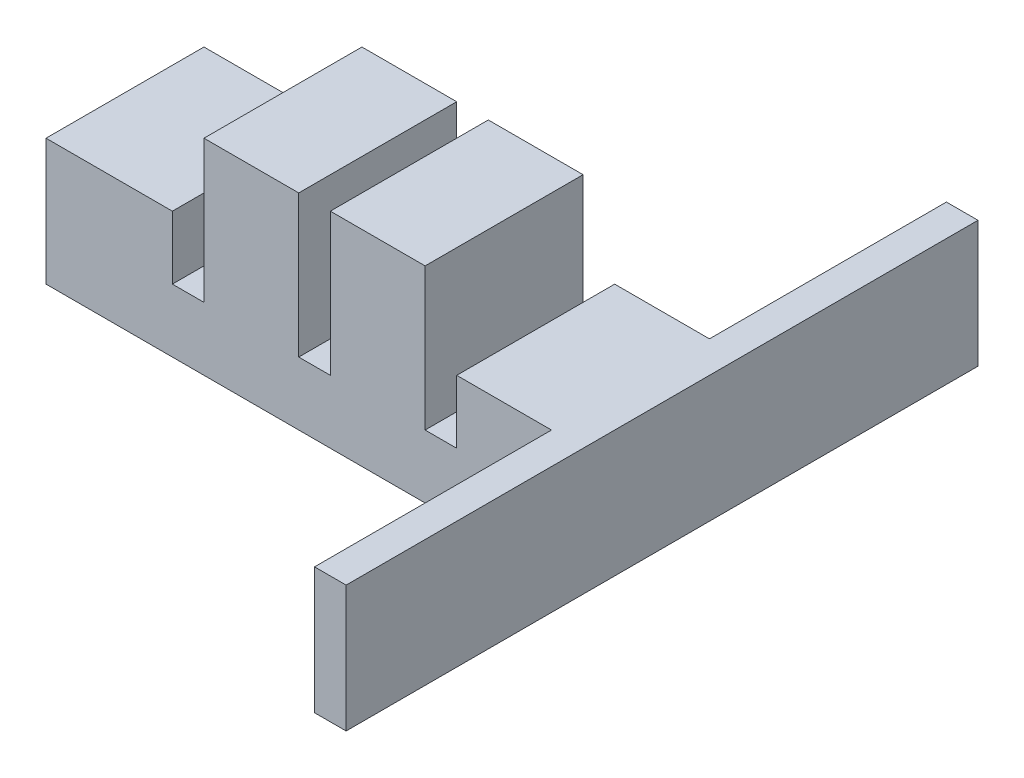
ISO-10303-21;
HEADER;
FILE_DESCRIPTION(('STEP AP214'),'2;1');
FILE_NAME('part.step','',(''),(''),'','','');
FILE_SCHEMA(('AUTOMOTIVE_DESIGN { 1 0 10303 214 1 1 1 1 }'));
ENDSEC;
DATA;
#1=APPLICATION_CONTEXT('core data for automotive mechanical design processes');
#2=APPLICATION_PROTOCOL_DEFINITION('international standard','automotive_design',2000,#1);
#3=PRODUCT_CONTEXT('',#1,'mechanical');
#4=PRODUCT('Part','Part','',(#3));
#5=PRODUCT_RELATED_PRODUCT_CATEGORY('part','',(#4));
#6=PRODUCT_DEFINITION_FORMATION('','',#4);
#7=PRODUCT_DEFINITION_CONTEXT('part definition',#1,'design');
#8=PRODUCT_DEFINITION('design','',#6,#7);
#9=PRODUCT_DEFINITION_SHAPE('','',#8);
#10=(LENGTH_UNIT() NAMED_UNIT(*) SI_UNIT(.MILLI.,.METRE.));
#11=(NAMED_UNIT(*) PLANE_ANGLE_UNIT() SI_UNIT($,.RADIAN.));
#12=(NAMED_UNIT(*) SI_UNIT($,.STERADIAN.) SOLID_ANGLE_UNIT());
#13=UNCERTAINTY_MEASURE_WITH_UNIT(LENGTH_MEASURE(1.E-05),#10,'distance_accuracy_value','');
#14=(GEOMETRIC_REPRESENTATION_CONTEXT(3) GLOBAL_UNCERTAINTY_ASSIGNED_CONTEXT((#13)) GLOBAL_UNIT_ASSIGNED_CONTEXT((#10,
#11,#12)) REPRESENTATION_CONTEXT('',''));
#15=CARTESIAN_POINT('',(0.,0.,0.));
#16=DIRECTION('',(0.,0.,1.));
#17=DIRECTION('',(1.,0.,0.));
#18=AXIS2_PLACEMENT_3D('',#15,#16,#17);
#19=CARTESIAN_POINT('',(-8.,13.,0.));
#20=DIRECTION('',(1.,0.,0.));
#21=DIRECTION('',(0.,0.,-1.));
#22=AXIS2_PLACEMENT_3D('',#19,#20,#21);
#23=PLANE('',#22);
#24=DIRECTION('',(0.,0.,-1.));
#25=VECTOR('',#24,1.);
#26=CARTESIAN_POINT('',(-8.,4.,-10.));
#27=LINE('',#26,#25);
#28=CARTESIAN_POINT('',(-8.,4.,0.));
#29=VERTEX_POINT('',#28);
#30=CARTESIAN_POINT('',(-8.,4.,-10.));
#31=VERTEX_POINT('',#30);
#32=EDGE_CURVE('E492',#29,#31,#27,.T.);
#33=ORIENTED_EDGE('',*,*,#32,.F.);
#34=DIRECTION('',(0.,-1.,0.));
#35=VECTOR('',#34,1.);
#36=CARTESIAN_POINT('',(-8.,13.,0.));
#37=LINE('',#36,#35);
#38=CARTESIAN_POINT('',(-8.,13.,0.));
#39=VERTEX_POINT('',#38);
#40=EDGE_CURVE('E11',#39,#29,#37,.T.);
#41=ORIENTED_EDGE('',*,*,#40,.F.);
#42=DIRECTION('',(0.,0.,1.));
#43=VECTOR('',#42,1.);
#44=CARTESIAN_POINT('',(-8.,13.,0.));
#45=LINE('',#44,#43);
#46=CARTESIAN_POINT('',(-8.,13.,-10.));
#47=VERTEX_POINT('',#46);
#48=EDGE_CURVE('E537',#47,#39,#45,.T.);
#49=ORIENTED_EDGE('',*,*,#48,.F.);
#50=DIRECTION('',(0.,-1.,0.));
#51=VECTOR('',#50,1.);
#52=CARTESIAN_POINT('',(-8.,13.,-10.));
#53=LINE('',#52,#51);
#54=EDGE_CURVE('E547',#47,#31,#53,.T.);
#55=ORIENTED_EDGE('',*,*,#54,.T.);
#56=EDGE_LOOP('',(#33,#41,#49,#55));
#57=FACE_BOUND('',#56,.T.);
#58=ADVANCED_FACE('F39',(#57),#23,.F.);
#59=CARTESIAN_POINT('',(-8.,13.,0.));
#60=DIRECTION('',(0.,0.,-1.));
#61=DIRECTION('',(-1.,0.,0.));
#62=AXIS2_PLACEMENT_3D('',#59,#60,#61);
#63=PLANE('',#62);
#64=DIRECTION('',(1.,0.,0.));
#65=VECTOR('',#64,1.);
#66=CARTESIAN_POINT('',(-8.,0.,0.));
#67=LINE('',#66,#65);
#68=CARTESIAN_POINT('',(-18.,0.,0.));
#69=VERTEX_POINT('',#68);
#70=CARTESIAN_POINT('',(14.,0.,0.));
#71=VERTEX_POINT('',#70);
#72=EDGE_CURVE('E530',#69,#71,#67,.T.);
#73=ORIENTED_EDGE('',*,*,#72,.T.);
#74=DIRECTION('',(0.,-1.,0.));
#75=VECTOR('',#74,1.);
#76=CARTESIAN_POINT('',(14.,0.,0.));
#77=LINE('',#76,#75);
#78=CARTESIAN_POINT('',(14.,8.,0.));
#79=VERTEX_POINT('',#78);
#80=EDGE_CURVE('E349',#79,#71,#77,.T.);
#81=ORIENTED_EDGE('',*,*,#80,.F.);
#82=DIRECTION('',(-1.,0.,0.));
#83=VECTOR('',#82,1.);
#84=CARTESIAN_POINT('',(14.,8.,0.));
#85=LINE('',#84,#83);
#86=CARTESIAN_POINT('',(8.,8.,0.));
#87=VERTEX_POINT('',#86);
#88=EDGE_CURVE('E356',#79,#87,#85,.T.);
#89=ORIENTED_EDGE('',*,*,#88,.T.);
#90=DIRECTION('',(0.,-1.,0.));
#91=VECTOR('',#90,1.);
#92=CARTESIAN_POINT('',(8.,0.,0.));
#93=LINE('',#92,#91);
#94=CARTESIAN_POINT('',(8.,4.,0.));
#95=VERTEX_POINT('',#94);
#96=EDGE_CURVE('E348',#87,#95,#93,.T.);
#97=ORIENTED_EDGE('',*,*,#96,.T.);
#98=DIRECTION('',(-1.,0.,0.));
#99=VECTOR('',#98,1.);
#100=CARTESIAN_POINT('',(8.,4.,0.));
#101=LINE('',#100,#99);
#102=CARTESIAN_POINT('',(6.,4.,0.));
#103=VERTEX_POINT('',#102);
#104=EDGE_CURVE('E371',#95,#103,#101,.T.);
#105=ORIENTED_EDGE('',*,*,#104,.T.);
#106=DIRECTION('',(0.,-1.,0.));
#107=VECTOR('',#106,1.);
#108=CARTESIAN_POINT('',(6.,13.,0.));
#109=LINE('',#108,#107);
#110=CARTESIAN_POINT('',(6.,13.,0.));
#111=VERTEX_POINT('',#110);
#112=EDGE_CURVE('E433',#111,#103,#109,.T.);
#113=ORIENTED_EDGE('',*,*,#112,.F.);
#114=DIRECTION('',(1.,0.,0.));
#115=VECTOR('',#114,1.);
#116=CARTESIAN_POINT('',(0.,13.,0.));
#117=LINE('',#116,#115);
#118=CARTESIAN_POINT('',(0.,13.,0.));
#119=VERTEX_POINT('',#118);
#120=EDGE_CURVE('E422',#119,#111,#117,.T.);
#121=ORIENTED_EDGE('',*,*,#120,.F.);
#122=DIRECTION('',(0.,-1.,0.));
#123=VECTOR('',#122,1.);
#124=CARTESIAN_POINT('',(0.,13.,0.));
#125=LINE('',#124,#123);
#126=CARTESIAN_POINT('',(0.,4.,0.));
#127=VERTEX_POINT('',#126);
#128=EDGE_CURVE('E435',#119,#127,#125,.T.);
#129=ORIENTED_EDGE('',*,*,#128,.T.);
#130=DIRECTION('',(1.,0.,0.));
#131=VECTOR('',#130,1.);
#132=CARTESIAN_POINT('',(-2.,4.,0.));
#133=LINE('',#132,#131);
#134=CARTESIAN_POINT('',(-2.,4.,0.));
#135=VERTEX_POINT('',#134);
#136=EDGE_CURVE('E384',#135,#127,#133,.T.);
#137=ORIENTED_EDGE('',*,*,#136,.F.);
#138=DIRECTION('',(0.,-1.,0.));
#139=VECTOR('',#138,1.);
#140=CARTESIAN_POINT('',(-2.,13.,0.));
#141=LINE('',#140,#139);
#142=CARTESIAN_POINT('',(-2.,13.,0.));
#143=VERTEX_POINT('',#142);
#144=EDGE_CURVE('E46',#143,#135,#141,.T.);
#145=ORIENTED_EDGE('',*,*,#144,.F.);
#146=DIRECTION('',(1.,0.,0.));
#147=VECTOR('',#146,1.);
#148=CARTESIAN_POINT('',(-8.,13.,0.));
#149=LINE('',#148,#147);
#150=EDGE_CURVE('E540',#39,#143,#149,.T.);
#151=ORIENTED_EDGE('',*,*,#150,.F.);
#152=ORIENTED_EDGE('',*,*,#40,.T.);
#153=DIRECTION('',(1.,0.,0.));
#154=VECTOR('',#153,1.);
#155=CARTESIAN_POINT('',(-10.,4.,0.));
#156=LINE('',#155,#154);
#157=CARTESIAN_POINT('',(-10.,4.,0.));
#158=VERTEX_POINT('',#157);
#159=EDGE_CURVE('E501',#158,#29,#156,.T.);
#160=ORIENTED_EDGE('',*,*,#159,.F.);
#161=DIRECTION('',(0.,1.,0.));
#162=VECTOR('',#161,1.);
#163=CARTESIAN_POINT('',(-10.,0.,0.));
#164=LINE('',#163,#162);
#165=CARTESIAN_POINT('',(-10.,8.,0.));
#166=VERTEX_POINT('',#165);
#167=EDGE_CURVE('E463',#158,#166,#164,.T.);
#168=ORIENTED_EDGE('',*,*,#167,.T.);
#169=DIRECTION('',(1.,0.,0.));
#170=VECTOR('',#169,1.);
#171=CARTESIAN_POINT('',(-18.,8.,0.));
#172=LINE('',#171,#170);
#173=CARTESIAN_POINT('',(-18.,8.,0.));
#174=VERTEX_POINT('',#173);
#175=EDGE_CURVE('E489',#174,#166,#172,.T.);
#176=ORIENTED_EDGE('',*,*,#175,.F.);
#177=DIRECTION('',(0.,1.,0.));
#178=VECTOR('',#177,1.);
#179=CARTESIAN_POINT('',(-18.,0.,0.));
#180=LINE('',#179,#178);
#181=EDGE_CURVE('E469',#69,#174,#180,.T.);
#182=ORIENTED_EDGE('',*,*,#181,.F.);
#183=EDGE_LOOP('',(#73,#81,#89,#97,#105,#113,#121,#129,#137,#145,#151,#152,#160,#168,#176,#182));
#184=FACE_BOUND('',#183,.T.);
#185=ADVANCED_FACE('F560',(#184),#63,.F.);
#186=CARTESIAN_POINT('',(-2.,13.,0.));
#187=DIRECTION('',(-1.,0.,0.));
#188=DIRECTION('',(0.,0.,1.));
#189=AXIS2_PLACEMENT_3D('',#186,#187,#188);
#190=PLANE('',#189);
#191=ORIENTED_EDGE('',*,*,#144,.T.);
#192=DIRECTION('',(0.,0.,-1.));
#193=VECTOR('',#192,1.);
#194=CARTESIAN_POINT('',(-2.,4.,-10.));
#195=LINE('',#194,#193);
#196=CARTESIAN_POINT('',(-2.,4.,-10.));
#197=VERTEX_POINT('',#196);
#198=EDGE_CURVE('E380',#135,#197,#195,.T.);
#199=ORIENTED_EDGE('',*,*,#198,.T.);
#200=DIRECTION('',(0.,-1.,0.));
#201=VECTOR('',#200,1.);
#202=CARTESIAN_POINT('',(-2.,13.,-10.));
#203=LINE('',#202,#201);
#204=CARTESIAN_POINT('',(-2.,13.,-10.));
#205=VERTEX_POINT('',#204);
#206=EDGE_CURVE('E551',#205,#197,#203,.T.);
#207=ORIENTED_EDGE('',*,*,#206,.F.);
#208=DIRECTION('',(0.,0.,-1.));
#209=VECTOR('',#208,1.);
#210=CARTESIAN_POINT('',(-2.,13.,0.));
#211=LINE('',#210,#209);
#212=EDGE_CURVE('E543',#143,#205,#211,.T.);
#213=ORIENTED_EDGE('',*,*,#212,.F.);
#214=EDGE_LOOP('',(#191,#199,#207,#213));
#215=FACE_BOUND('',#214,.T.);
#216=ADVANCED_FACE('F557',(#215),#190,.F.);
#217=CARTESIAN_POINT('',(-8.,13.,-10.));
#218=DIRECTION('',(0.,0.,1.));
#219=DIRECTION('',(1.,0.,0.));
#220=AXIS2_PLACEMENT_3D('',#217,#218,#219);
#221=PLANE('',#220);
#222=DIRECTION('',(-1.,0.,0.));
#223=VECTOR('',#222,1.);
#224=CARTESIAN_POINT('',(-8.,0.,-10.));
#225=LINE('',#224,#223);
#226=CARTESIAN_POINT('',(14.,0.,-10.));
#227=VERTEX_POINT('',#226);
#228=CARTESIAN_POINT('',(-18.,0.,-10.));
#229=VERTEX_POINT('',#228);
#230=EDGE_CURVE('E541',#227,#229,#225,.T.);
#231=ORIENTED_EDGE('',*,*,#230,.T.);
#232=DIRECTION('',(0.,-1.,0.));
#233=VECTOR('',#232,1.);
#234=CARTESIAN_POINT('',(-18.,0.,-10.));
#235=LINE('',#234,#233);
#236=CARTESIAN_POINT('',(-18.,8.,-10.));
#237=VERTEX_POINT('',#236);
#238=EDGE_CURVE('E475',#237,#229,#235,.T.);
#239=ORIENTED_EDGE('',*,*,#238,.F.);
#240=DIRECTION('',(1.,0.,0.));
#241=VECTOR('',#240,1.);
#242=CARTESIAN_POINT('',(-18.,8.,-10.));
#243=LINE('',#242,#241);
#244=CARTESIAN_POINT('',(-10.,8.,-10.));
#245=VERTEX_POINT('',#244);
#246=EDGE_CURVE('E481',#237,#245,#243,.T.);
#247=ORIENTED_EDGE('',*,*,#246,.T.);
#248=DIRECTION('',(0.,-1.,0.));
#249=VECTOR('',#248,1.);
#250=CARTESIAN_POINT('',(-10.,0.,-10.));
#251=LINE('',#250,#249);
#252=CARTESIAN_POINT('',(-10.,4.,-10.));
#253=VERTEX_POINT('',#252);
#254=EDGE_CURVE('E473',#245,#253,#251,.T.);
#255=ORIENTED_EDGE('',*,*,#254,.T.);
#256=DIRECTION('',(1.,0.,0.));
#257=VECTOR('',#256,1.);
#258=CARTESIAN_POINT('',(-10.,4.,-10.));
#259=LINE('',#258,#257);
#260=EDGE_CURVE('E496',#253,#31,#259,.T.);
#261=ORIENTED_EDGE('',*,*,#260,.T.);
#262=ORIENTED_EDGE('',*,*,#54,.F.);
#263=DIRECTION('',(-1.,0.,0.));
#264=VECTOR('',#263,1.);
#265=CARTESIAN_POINT('',(-8.,13.,-10.));
#266=LINE('',#265,#264);
#267=EDGE_CURVE('E545',#205,#47,#266,.T.);
#268=ORIENTED_EDGE('',*,*,#267,.F.);
#269=ORIENTED_EDGE('',*,*,#206,.T.);
#270=DIRECTION('',(1.,0.,0.));
#271=VECTOR('',#270,1.);
#272=CARTESIAN_POINT('',(-2.,4.,-10.));
#273=LINE('',#272,#271);
#274=CARTESIAN_POINT('',(0.,4.,-10.));
#275=VERTEX_POINT('',#274);
#276=EDGE_CURVE('E53',#197,#275,#273,.T.);
#277=ORIENTED_EDGE('',*,*,#276,.T.);
#278=DIRECTION('',(0.,-1.,0.));
#279=VECTOR('',#278,1.);
#280=CARTESIAN_POINT('',(0.,13.,-10.));
#281=LINE('',#280,#279);
#282=CARTESIAN_POINT('',(0.,13.,-10.));
#283=VERTEX_POINT('',#282);
#284=EDGE_CURVE('E428',#283,#275,#281,.T.);
#285=ORIENTED_EDGE('',*,*,#284,.F.);
#286=DIRECTION('',(-1.,0.,0.));
#287=VECTOR('',#286,1.);
#288=CARTESIAN_POINT('',(0.,13.,-10.));
#289=LINE('',#288,#287);
#290=CARTESIAN_POINT('',(6.,13.,-10.));
#291=VERTEX_POINT('',#290);
#292=EDGE_CURVE('E426',#291,#283,#289,.T.);
#293=ORIENTED_EDGE('',*,*,#292,.F.);
#294=DIRECTION('',(0.,-1.,0.));
#295=VECTOR('',#294,1.);
#296=CARTESIAN_POINT('',(6.,13.,-10.));
#297=LINE('',#296,#295);
#298=CARTESIAN_POINT('',(6.,4.,-10.));
#299=VERTEX_POINT('',#298);
#300=EDGE_CURVE('E430',#291,#299,#297,.T.);
#301=ORIENTED_EDGE('',*,*,#300,.T.);
#302=DIRECTION('',(-1.,0.,0.));
#303=VECTOR('',#302,1.);
#304=CARTESIAN_POINT('',(8.,4.,-10.));
#305=LINE('',#304,#303);
#306=CARTESIAN_POINT('',(8.,4.,-10.));
#307=VERTEX_POINT('',#306);
#308=EDGE_CURVE('E376',#307,#299,#305,.T.);
#309=ORIENTED_EDGE('',*,*,#308,.F.);
#310=DIRECTION('',(0.,1.,0.));
#311=VECTOR('',#310,1.);
#312=CARTESIAN_POINT('',(8.,0.,-10.));
#313=LINE('',#312,#311);
#314=CARTESIAN_POINT('',(8.,8.,-10.));
#315=VERTEX_POINT('',#314);
#316=EDGE_CURVE('E359',#307,#315,#313,.T.);
#317=ORIENTED_EDGE('',*,*,#316,.T.);
#318=DIRECTION('',(-1.,0.,0.));
#319=VECTOR('',#318,1.);
#320=CARTESIAN_POINT('',(14.,8.,-10.));
#321=LINE('',#320,#319);
#322=CARTESIAN_POINT('',(14.,8.,-10.));
#323=VERTEX_POINT('',#322);
#324=EDGE_CURVE('E364',#323,#315,#321,.T.);
#325=ORIENTED_EDGE('',*,*,#324,.F.);
#326=DIRECTION('',(0.,1.,0.));
#327=VECTOR('',#326,1.);
#328=CARTESIAN_POINT('',(14.,0.,-10.));
#329=LINE('',#328,#327);
#330=EDGE_CURVE('E352',#227,#323,#329,.T.);
#331=ORIENTED_EDGE('',*,*,#330,.F.);
#332=EDGE_LOOP('',(#231,#239,#247,#255,#261,#262,#268,#269,#277,#285,#293,#301,#309,#317,#325,#331));
#333=FACE_BOUND('',#332,.T.);
#334=ADVANCED_FACE('F631',(#333),#221,.F.);
#335=CARTESIAN_POINT('',(-8.,13.,0.));
#336=DIRECTION('',(0.,-1.,0.));
#337=DIRECTION('',(0.,0.,-1.));
#338=AXIS2_PLACEMENT_3D('',#335,#336,#337);
#339=PLANE('',#338);
#340=ORIENTED_EDGE('',*,*,#48,.T.);
#341=ORIENTED_EDGE('',*,*,#150,.T.);
#342=ORIENTED_EDGE('',*,*,#212,.T.);
#343=ORIENTED_EDGE('',*,*,#267,.T.);
#344=EDGE_LOOP('',(#340,#341,#342,#343));
#345=FACE_BOUND('',#344,.T.);
#346=ADVANCED_FACE('F707',(#345),#339,.F.);
#347=CARTESIAN_POINT('',(-8.,0.,0.));
#348=DIRECTION('',(0.,-1.,0.));
#349=DIRECTION('',(0.,0.,-1.));
#350=AXIS2_PLACEMENT_3D('',#347,#348,#349);
#351=PLANE('',#350);
#352=DIRECTION('',(0.,0.,-1.));
#353=VECTOR('',#352,1.);
#354=CARTESIAN_POINT('',(-15.,0.,-2.));
#355=LINE('',#354,#353);
#356=CARTESIAN_POINT('',(-15.,0.,-2.));
#357=VERTEX_POINT('',#356);
#358=CARTESIAN_POINT('',(-15.,0.,-8.));
#359=VERTEX_POINT('',#358);
#360=EDGE_CURVE('E61',#357,#359,#355,.T.);
#361=ORIENTED_EDGE('',*,*,#360,.F.);
#362=DIRECTION('',(-1.,0.,0.));
#363=VECTOR('',#362,1.);
#364=CARTESIAN_POINT('',(-15.,0.,-2.));
#365=LINE('',#364,#363);
#366=CARTESIAN_POINT('',(-11.,0.,-2.));
#367=VERTEX_POINT('',#366);
#368=EDGE_CURVE('E442',#367,#357,#365,.T.);
#369=ORIENTED_EDGE('',*,*,#368,.F.);
#370=DIRECTION('',(0.,0.,1.));
#371=VECTOR('',#370,1.);
#372=CARTESIAN_POINT('',(-11.,0.,-2.));
#373=LINE('',#372,#371);
#374=CARTESIAN_POINT('',(-11.,0.,-8.));
#375=VERTEX_POINT('',#374);
#376=EDGE_CURVE('E456',#375,#367,#373,.T.);
#377=ORIENTED_EDGE('',*,*,#376,.F.);
#378=DIRECTION('',(1.,0.,0.));
#379=VECTOR('',#378,1.);
#380=CARTESIAN_POINT('',(-15.,0.,-8.));
#381=LINE('',#380,#379);
#382=EDGE_CURVE('E453',#359,#375,#381,.T.);
#383=ORIENTED_EDGE('',*,*,#382,.F.);
#384=EDGE_LOOP('',(#361,#369,#377,#383));
#385=FACE_BOUND('',#384,.T.);
#386=DIRECTION('',(0.,0.,1.));
#387=VECTOR('',#386,1.);
#388=CARTESIAN_POINT('',(-3.,0.,-2.));
#389=LINE('',#388,#387);
#390=CARTESIAN_POINT('',(-3.,0.,-8.));
#391=VERTEX_POINT('',#390);
#392=CARTESIAN_POINT('',(-3.,0.,-2.));
#393=VERTEX_POINT('',#392);
#394=EDGE_CURVE('E504',#391,#393,#389,.T.);
#395=ORIENTED_EDGE('',*,*,#394,.F.);
#396=DIRECTION('',(1.,0.,0.));
#397=VECTOR('',#396,1.);
#398=CARTESIAN_POINT('',(-3.,0.,-8.));
#399=LINE('',#398,#397);
#400=CARTESIAN_POINT('',(-7.,0.,-8.));
#401=VERTEX_POINT('',#400);
#402=EDGE_CURVE('E509',#401,#391,#399,.T.);
#403=ORIENTED_EDGE('',*,*,#402,.F.);
#404=DIRECTION('',(0.,0.,-1.));
#405=VECTOR('',#404,1.);
#406=CARTESIAN_POINT('',(-7.,0.,-2.));
#407=LINE('',#406,#405);
#408=CARTESIAN_POINT('',(-7.,0.,-2.));
#409=VERTEX_POINT('',#408);
#410=EDGE_CURVE('E523',#409,#401,#407,.T.);
#411=ORIENTED_EDGE('',*,*,#410,.F.);
#412=DIRECTION('',(-1.,0.,0.));
#413=VECTOR('',#412,1.);
#414=CARTESIAN_POINT('',(-3.,0.,-2.));
#415=LINE('',#414,#413);
#416=EDGE_CURVE('E520',#393,#409,#415,.T.);
#417=ORIENTED_EDGE('',*,*,#416,.F.);
#418=EDGE_LOOP('',(#395,#403,#411,#417));
#419=FACE_BOUND('',#418,.T.);
#420=ORIENTED_EDGE('',*,*,#72,.F.);
#421=DIRECTION('',(0.,0.,1.));
#422=VECTOR('',#421,1.);
#423=CARTESIAN_POINT('',(-18.,0.,0.));
#424=LINE('',#423,#422);
#425=EDGE_CURVE('E478',#229,#69,#424,.T.);
#426=ORIENTED_EDGE('',*,*,#425,.F.);
#427=ORIENTED_EDGE('',*,*,#230,.F.);
#428=DIRECTION('',(0.,0.,-1.));
#429=VECTOR('',#428,1.);
#430=CARTESIAN_POINT('',(14.,0.,-25.));
#431=LINE('',#430,#429);
#432=CARTESIAN_POINT('',(14.,0.,-25.));
#433=VERTEX_POINT('',#432);
#434=EDGE_CURVE('E312',#227,#433,#431,.T.);
#435=ORIENTED_EDGE('',*,*,#434,.T.);
#436=DIRECTION('',(-1.,0.,0.));
#437=VECTOR('',#436,1.);
#438=CARTESIAN_POINT('',(16.,0.,-25.));
#439=LINE('',#438,#437);
#440=CARTESIAN_POINT('',(16.,0.,-25.));
#441=VERTEX_POINT('',#440);
#442=EDGE_CURVE('E345',#441,#433,#439,.T.);
#443=ORIENTED_EDGE('',*,*,#442,.F.);
#444=DIRECTION('',(0.,0.,-1.));
#445=VECTOR('',#444,1.);
#446=CARTESIAN_POINT('',(16.,0.,-25.));
#447=LINE('',#446,#445);
#448=CARTESIAN_POINT('',(16.,0.,15.));
#449=VERTEX_POINT('',#448);
#450=EDGE_CURVE('E316',#449,#441,#447,.T.);
#451=ORIENTED_EDGE('',*,*,#450,.F.);
#452=DIRECTION('',(-1.,0.,0.));
#453=VECTOR('',#452,1.);
#454=CARTESIAN_POINT('',(16.,0.,15.));
#455=LINE('',#454,#453);
#456=CARTESIAN_POINT('',(14.,0.,15.));
#457=VERTEX_POINT('',#456);
#458=EDGE_CURVE('E326',#449,#457,#455,.T.);
#459=ORIENTED_EDGE('',*,*,#458,.T.);
#460=EDGE_CURVE('E327',#457,#71,#431,.T.);
#461=ORIENTED_EDGE('',*,*,#460,.T.);
#462=EDGE_LOOP('',(#420,#426,#427,#435,#443,#451,#459,#461));
#463=FACE_BOUND('',#462,.T.);
#464=DIRECTION('',(0.,0.,-1.));
#465=VECTOR('',#464,1.);
#466=CARTESIAN_POINT('',(9.,0.,-2.));
#467=LINE('',#466,#465);
#468=CARTESIAN_POINT('',(9.,0.,-2.));
#469=VERTEX_POINT('',#468);
#470=CARTESIAN_POINT('',(9.,0.,-8.));
#471=VERTEX_POINT('',#470);
#472=EDGE_CURVE('E280',#469,#471,#467,.T.);
#473=ORIENTED_EDGE('',*,*,#472,.F.);
#474=DIRECTION('',(-1.,0.,0.));
#475=VECTOR('',#474,1.);
#476=CARTESIAN_POINT('',(9.,0.,-2.));
#477=LINE('',#476,#475);
#478=CARTESIAN_POINT('',(13.,0.,-2.));
#479=VERTEX_POINT('',#478);
#480=EDGE_CURVE('E297',#479,#469,#477,.T.);
#481=ORIENTED_EDGE('',*,*,#480,.F.);
#482=DIRECTION('',(0.,0.,1.));
#483=VECTOR('',#482,1.);
#484=CARTESIAN_POINT('',(13.,0.,-2.));
#485=LINE('',#484,#483);
#486=CARTESIAN_POINT('',(13.,0.,-8.));
#487=VERTEX_POINT('',#486);
#488=EDGE_CURVE('E300',#487,#479,#485,.T.);
#489=ORIENTED_EDGE('',*,*,#488,.F.);
#490=DIRECTION('',(1.,0.,0.));
#491=VECTOR('',#490,1.);
#492=CARTESIAN_POINT('',(9.,0.,-8.));
#493=LINE('',#492,#491);
#494=EDGE_CURVE('E306',#471,#487,#493,.T.);
#495=ORIENTED_EDGE('',*,*,#494,.F.);
#496=EDGE_LOOP('',(#473,#481,#489,#495));
#497=FACE_BOUND('',#496,.T.);
#498=DIRECTION('',(0.,0.,1.));
#499=VECTOR('',#498,1.);
#500=CARTESIAN_POINT('',(5.,0.,-2.));
#501=LINE('',#500,#499);
#502=CARTESIAN_POINT('',(5.,0.,-8.));
#503=VERTEX_POINT('',#502);
#504=CARTESIAN_POINT('',(5.,0.,-2.));
#505=VERTEX_POINT('',#504);
#506=EDGE_CURVE('E387',#503,#505,#501,.T.);
#507=ORIENTED_EDGE('',*,*,#506,.F.);
#508=DIRECTION('',(1.,0.,0.));
#509=VECTOR('',#508,1.);
#510=CARTESIAN_POINT('',(5.,0.,-8.));
#511=LINE('',#510,#509);
#512=CARTESIAN_POINT('',(1.,0.,-8.));
#513=VERTEX_POINT('',#512);
#514=EDGE_CURVE('E392',#513,#503,#511,.T.);
#515=ORIENTED_EDGE('',*,*,#514,.F.);
#516=DIRECTION('',(0.,0.,-1.));
#517=VECTOR('',#516,1.);
#518=CARTESIAN_POINT('',(1.,0.,-2.));
#519=LINE('',#518,#517);
#520=CARTESIAN_POINT('',(1.,0.,-2.));
#521=VERTEX_POINT('',#520);
#522=EDGE_CURVE('E406',#521,#513,#519,.T.);
#523=ORIENTED_EDGE('',*,*,#522,.F.);
#524=DIRECTION('',(-1.,0.,0.));
#525=VECTOR('',#524,1.);
#526=CARTESIAN_POINT('',(5.,0.,-2.));
#527=LINE('',#526,#525);
#528=EDGE_CURVE('E403',#505,#521,#527,.T.);
#529=ORIENTED_EDGE('',*,*,#528,.F.);
#530=EDGE_LOOP('',(#507,#515,#523,#529));
#531=FACE_BOUND('',#530,.T.);
#532=ADVANCED_FACE('F603',(#385,#419,#463,#497,#531),#351,.T.);
#533=CARTESIAN_POINT('',(-3.,11.,-2.));
#534=DIRECTION('',(1.,0.,0.));
#535=DIRECTION('',(0.,0.,-1.));
#536=AXIS2_PLACEMENT_3D('',#533,#534,#535);
#537=PLANE('',#536);
#538=ORIENTED_EDGE('',*,*,#394,.T.);
#539=DIRECTION('',(0.,-1.,0.));
#540=VECTOR('',#539,1.);
#541=CARTESIAN_POINT('',(-3.,11.,-2.));
#542=LINE('',#541,#540);
#543=CARTESIAN_POINT('',(-3.,11.,-2.));
#544=VERTEX_POINT('',#543);
#545=EDGE_CURVE('E518',#544,#393,#542,.T.);
#546=ORIENTED_EDGE('',*,*,#545,.F.);
#547=DIRECTION('',(0.,0.,1.));
#548=VECTOR('',#547,1.);
#549=CARTESIAN_POINT('',(-3.,11.,-2.));
#550=LINE('',#549,#548);
#551=CARTESIAN_POINT('',(-3.,11.,-8.));
#552=VERTEX_POINT('',#551);
#553=EDGE_CURVE('E505',#552,#544,#550,.T.);
#554=ORIENTED_EDGE('',*,*,#553,.F.);
#555=DIRECTION('',(0.,-1.,0.));
#556=VECTOR('',#555,1.);
#557=CARTESIAN_POINT('',(-3.,11.,-8.));
#558=LINE('',#557,#556);
#559=EDGE_CURVE('E528',#552,#391,#558,.T.);
#560=ORIENTED_EDGE('',*,*,#559,.T.);
#561=EDGE_LOOP('',(#538,#546,#554,#560));
#562=FACE_BOUND('',#561,.T.);
#563=ADVANCED_FACE('F696',(#562),#537,.F.);
#564=CARTESIAN_POINT('',(-3.,11.,-8.));
#565=DIRECTION('',(0.,0.,-1.));
#566=DIRECTION('',(-1.,0.,0.));
#567=AXIS2_PLACEMENT_3D('',#564,#565,#566);
#568=PLANE('',#567);
#569=ORIENTED_EDGE('',*,*,#402,.T.);
#570=ORIENTED_EDGE('',*,*,#559,.F.);
#571=DIRECTION('',(1.,0.,0.));
#572=VECTOR('',#571,1.);
#573=CARTESIAN_POINT('',(-3.,11.,-8.));
#574=LINE('',#573,#572);
#575=CARTESIAN_POINT('',(-7.,11.,-8.));
#576=VERTEX_POINT('',#575);
#577=EDGE_CURVE('E515',#576,#552,#574,.T.);
#578=ORIENTED_EDGE('',*,*,#577,.F.);
#579=DIRECTION('',(0.,-1.,0.));
#580=VECTOR('',#579,1.);
#581=CARTESIAN_POINT('',(-7.,11.,-8.));
#582=LINE('',#581,#580);
#583=EDGE_CURVE('E531',#576,#401,#582,.T.);
#584=ORIENTED_EDGE('',*,*,#583,.T.);
#585=EDGE_LOOP('',(#569,#570,#578,#584));
#586=FACE_BOUND('',#585,.T.);
#587=ADVANCED_FACE('F692',(#586),#568,.F.);
#588=CARTESIAN_POINT('',(-7.,11.,-2.));
#589=DIRECTION('',(-1.,0.,0.));
#590=DIRECTION('',(0.,0.,1.));
#591=AXIS2_PLACEMENT_3D('',#588,#589,#590);
#592=PLANE('',#591);
#593=ORIENTED_EDGE('',*,*,#410,.T.);
#594=ORIENTED_EDGE('',*,*,#583,.F.);
#595=DIRECTION('',(0.,0.,-1.));
#596=VECTOR('',#595,1.);
#597=CARTESIAN_POINT('',(-7.,11.,-2.));
#598=LINE('',#597,#596);
#599=CARTESIAN_POINT('',(-7.,11.,-2.));
#600=VERTEX_POINT('',#599);
#601=EDGE_CURVE('E512',#600,#576,#598,.T.);
#602=ORIENTED_EDGE('',*,*,#601,.F.);
#603=DIRECTION('',(0.,-1.,0.));
#604=VECTOR('',#603,1.);
#605=CARTESIAN_POINT('',(-7.,11.,-2.));
#606=LINE('',#605,#604);
#607=EDGE_CURVE('E533',#600,#409,#606,.T.);
#608=ORIENTED_EDGE('',*,*,#607,.T.);
#609=EDGE_LOOP('',(#593,#594,#602,#608));
#610=FACE_BOUND('',#609,.T.);
#611=ADVANCED_FACE('F695',(#610),#592,.F.);
#612=CARTESIAN_POINT('',(-3.,11.,-2.));
#613=DIRECTION('',(0.,0.,1.));
#614=DIRECTION('',(1.,0.,0.));
#615=AXIS2_PLACEMENT_3D('',#612,#613,#614);
#616=PLANE('',#615);
#617=ORIENTED_EDGE('',*,*,#416,.T.);
#618=ORIENTED_EDGE('',*,*,#607,.F.);
#619=DIRECTION('',(-1.,0.,0.));
#620=VECTOR('',#619,1.);
#621=CARTESIAN_POINT('',(-3.,11.,-2.));
#622=LINE('',#621,#620);
#623=EDGE_CURVE('E508',#544,#600,#622,.T.);
#624=ORIENTED_EDGE('',*,*,#623,.F.);
#625=ORIENTED_EDGE('',*,*,#545,.T.);
#626=EDGE_LOOP('',(#617,#618,#624,#625));
#627=FACE_BOUND('',#626,.T.);
#628=ADVANCED_FACE('F690',(#627),#616,.F.);
#629=CARTESIAN_POINT('',(-8.,11.,0.));
#630=DIRECTION('',(0.,1.,0.));
#631=DIRECTION('',(0.,0.,1.));
#632=AXIS2_PLACEMENT_3D('',#629,#630,#631);
#633=PLANE('',#632);
#634=ORIENTED_EDGE('',*,*,#553,.T.);
#635=ORIENTED_EDGE('',*,*,#623,.T.);
#636=ORIENTED_EDGE('',*,*,#601,.T.);
#637=ORIENTED_EDGE('',*,*,#577,.T.);
#638=EDGE_LOOP('',(#634,#635,#636,#637));
#639=FACE_BOUND('',#638,.T.);
#640=ADVANCED_FACE('F687',(#639),#633,.F.);
#641=CARTESIAN_POINT('',(-10.,4.,-10.));
#642=DIRECTION('',(0.,-1.,0.));
#643=DIRECTION('',(0.,0.,-1.));
#644=AXIS2_PLACEMENT_3D('',#641,#642,#643);
#645=PLANE('',#644);
#646=ORIENTED_EDGE('',*,*,#32,.T.);
#647=ORIENTED_EDGE('',*,*,#260,.F.);
#648=DIRECTION('',(0.,0.,-1.));
#649=VECTOR('',#648,1.);
#650=CARTESIAN_POINT('',(-10.,4.,-10.));
#651=LINE('',#650,#649);
#652=EDGE_CURVE('E493',#158,#253,#651,.T.);
#653=ORIENTED_EDGE('',*,*,#652,.F.);
#654=ORIENTED_EDGE('',*,*,#159,.T.);
#655=EDGE_LOOP('',(#646,#647,#653,#654));
#656=FACE_BOUND('',#655,.T.);
#657=ADVANCED_FACE('F587',(#656),#645,.F.);
#658=CARTESIAN_POINT('',(-10.,0.,0.));
#659=DIRECTION('',(-1.,0.,0.));
#660=DIRECTION('',(0.,0.,1.));
#661=AXIS2_PLACEMENT_3D('',#658,#659,#660);
#662=PLANE('',#661);
#663=ORIENTED_EDGE('',*,*,#167,.F.);
#664=ORIENTED_EDGE('',*,*,#652,.T.);
#665=ORIENTED_EDGE('',*,*,#254,.F.);
#666=DIRECTION('',(0.,0.,-1.));
#667=VECTOR('',#666,1.);
#668=CARTESIAN_POINT('',(-10.,8.,0.));
#669=LINE('',#668,#667);
#670=EDGE_CURVE('E483',#166,#245,#669,.T.);
#671=ORIENTED_EDGE('',*,*,#670,.F.);
#672=EDGE_LOOP('',(#663,#664,#665,#671));
#673=FACE_BOUND('',#672,.T.);
#674=ADVANCED_FACE('F592',(#673),#662,.F.);
#675=CARTESIAN_POINT('',(-18.,8.,0.));
#676=DIRECTION('',(0.,-1.,0.));
#677=DIRECTION('',(0.,0.,-1.));
#678=AXIS2_PLACEMENT_3D('',#675,#676,#677);
#679=PLANE('',#678);
#680=ORIENTED_EDGE('',*,*,#670,.T.);
#681=ORIENTED_EDGE('',*,*,#246,.F.);
#682=DIRECTION('',(0.,0.,-1.));
#683=VECTOR('',#682,1.);
#684=CARTESIAN_POINT('',(-18.,8.,0.));
#685=LINE('',#684,#683);
#686=EDGE_CURVE('E472',#174,#237,#685,.T.);
#687=ORIENTED_EDGE('',*,*,#686,.F.);
#688=ORIENTED_EDGE('',*,*,#175,.T.);
#689=EDGE_LOOP('',(#680,#681,#687,#688));
#690=FACE_BOUND('',#689,.T.);
#691=ADVANCED_FACE('F596',(#690),#679,.F.);
#692=CARTESIAN_POINT('',(-18.,0.,0.));
#693=DIRECTION('',(-1.,0.,0.));
#694=DIRECTION('',(0.,0.,1.));
#695=AXIS2_PLACEMENT_3D('',#692,#693,#694);
#696=PLANE('',#695);
#697=ORIENTED_EDGE('',*,*,#181,.T.);
#698=ORIENTED_EDGE('',*,*,#686,.T.);
#699=ORIENTED_EDGE('',*,*,#238,.T.);
#700=ORIENTED_EDGE('',*,*,#425,.T.);
#701=EDGE_LOOP('',(#697,#698,#699,#700));
#702=FACE_BOUND('',#701,.T.);
#703=ADVANCED_FACE('F600',(#702),#696,.T.);
#704=CARTESIAN_POINT('',(-15.,6.,-2.));
#705=DIRECTION('',(-1.,0.,0.));
#706=DIRECTION('',(0.,0.,1.));
#707=AXIS2_PLACEMENT_3D('',#704,#705,#706);
#708=PLANE('',#707);
#709=ORIENTED_EDGE('',*,*,#360,.T.);
#710=DIRECTION('',(0.,-1.,0.));
#711=VECTOR('',#710,1.);
#712=CARTESIAN_POINT('',(-15.,6.,-8.));
#713=LINE('',#712,#711);
#714=CARTESIAN_POINT('',(-15.,6.,-8.));
#715=VERTEX_POINT('',#714);
#716=EDGE_CURVE('E451',#715,#359,#713,.T.);
#717=ORIENTED_EDGE('',*,*,#716,.F.);
#718=DIRECTION('',(0.,0.,-1.));
#719=VECTOR('',#718,1.);
#720=CARTESIAN_POINT('',(-15.,6.,-2.));
#721=LINE('',#720,#719);
#722=CARTESIAN_POINT('',(-15.,6.,-2.));
#723=VERTEX_POINT('',#722);
#724=EDGE_CURVE('E438',#723,#715,#721,.T.);
#725=ORIENTED_EDGE('',*,*,#724,.F.);
#726=DIRECTION('',(0.,-1.,0.));
#727=VECTOR('',#726,1.);
#728=CARTESIAN_POINT('',(-15.,6.,-2.));
#729=LINE('',#728,#727);
#730=EDGE_CURVE('E461',#723,#357,#729,.T.);
#731=ORIENTED_EDGE('',*,*,#730,.T.);
#732=EDGE_LOOP('',(#709,#717,#725,#731));
#733=FACE_BOUND('',#732,.T.);
#734=ADVANCED_FACE('F669',(#733),#708,.F.);
#735=CARTESIAN_POINT('',(-15.,6.,-2.));
#736=DIRECTION('',(0.,0.,1.));
#737=DIRECTION('',(1.,0.,0.));
#738=AXIS2_PLACEMENT_3D('',#735,#736,#737);
#739=PLANE('',#738);
#740=ORIENTED_EDGE('',*,*,#368,.T.);
#741=ORIENTED_EDGE('',*,*,#730,.F.);
#742=DIRECTION('',(-1.,0.,0.));
#743=VECTOR('',#742,1.);
#744=CARTESIAN_POINT('',(-15.,6.,-2.));
#745=LINE('',#744,#743);
#746=CARTESIAN_POINT('',(-11.,6.,-2.));
#747=VERTEX_POINT('',#746);
#748=EDGE_CURVE('E448',#747,#723,#745,.T.);
#749=ORIENTED_EDGE('',*,*,#748,.F.);
#750=DIRECTION('',(0.,-1.,0.));
#751=VECTOR('',#750,1.);
#752=CARTESIAN_POINT('',(-11.,6.,-2.));
#753=LINE('',#752,#751);
#754=EDGE_CURVE('E464',#747,#367,#753,.T.);
#755=ORIENTED_EDGE('',*,*,#754,.T.);
#756=EDGE_LOOP('',(#740,#741,#749,#755));
#757=FACE_BOUND('',#756,.T.);
#758=ADVANCED_FACE('F665',(#757),#739,.F.);
#759=CARTESIAN_POINT('',(-11.,6.,-2.));
#760=DIRECTION('',(1.,0.,0.));
#761=DIRECTION('',(0.,0.,-1.));
#762=AXIS2_PLACEMENT_3D('',#759,#760,#761);
#763=PLANE('',#762);
#764=ORIENTED_EDGE('',*,*,#376,.T.);
#765=ORIENTED_EDGE('',*,*,#754,.F.);
#766=DIRECTION('',(0.,0.,1.));
#767=VECTOR('',#766,1.);
#768=CARTESIAN_POINT('',(-11.,6.,-2.));
#769=LINE('',#768,#767);
#770=CARTESIAN_POINT('',(-11.,6.,-8.));
#771=VERTEX_POINT('',#770);
#772=EDGE_CURVE('E445',#771,#747,#769,.T.);
#773=ORIENTED_EDGE('',*,*,#772,.F.);
#774=DIRECTION('',(0.,-1.,0.));
#775=VECTOR('',#774,1.);
#776=CARTESIAN_POINT('',(-11.,6.,-8.));
#777=LINE('',#776,#775);
#778=EDGE_CURVE('E466',#771,#375,#777,.T.);
#779=ORIENTED_EDGE('',*,*,#778,.T.);
#780=EDGE_LOOP('',(#764,#765,#773,#779));
#781=FACE_BOUND('',#780,.T.);
#782=ADVANCED_FACE('F668',(#781),#763,.F.);
#783=CARTESIAN_POINT('',(-15.,6.,-8.));
#784=DIRECTION('',(0.,0.,-1.));
#785=DIRECTION('',(-1.,0.,0.));
#786=AXIS2_PLACEMENT_3D('',#783,#784,#785);
#787=PLANE('',#786);
#788=ORIENTED_EDGE('',*,*,#382,.T.);
#789=ORIENTED_EDGE('',*,*,#778,.F.);
#790=DIRECTION('',(1.,0.,0.));
#791=VECTOR('',#790,1.);
#792=CARTESIAN_POINT('',(-15.,6.,-8.));
#793=LINE('',#792,#791);
#794=EDGE_CURVE('E441',#715,#771,#793,.T.);
#795=ORIENTED_EDGE('',*,*,#794,.F.);
#796=ORIENTED_EDGE('',*,*,#716,.T.);
#797=EDGE_LOOP('',(#788,#789,#795,#796));
#798=FACE_BOUND('',#797,.T.);
#799=ADVANCED_FACE('F663',(#798),#787,.F.);
#800=CARTESIAN_POINT('',(0.,6.,0.));
#801=DIRECTION('',(0.,-1.,0.));
#802=DIRECTION('',(0.,0.,-1.));
#803=AXIS2_PLACEMENT_3D('',#800,#801,#802);
#804=PLANE('',#803);
#805=ORIENTED_EDGE('',*,*,#724,.T.);
#806=ORIENTED_EDGE('',*,*,#794,.T.);
#807=ORIENTED_EDGE('',*,*,#772,.T.);
#808=ORIENTED_EDGE('',*,*,#748,.T.);
#809=EDGE_LOOP('',(#805,#806,#807,#808));
#810=FACE_BOUND('',#809,.T.);
#811=ADVANCED_FACE('F658',(#810),#804,.T.);
#812=CARTESIAN_POINT('',(6.,13.,0.));
#813=DIRECTION('',(-1.,0.,0.));
#814=DIRECTION('',(0.,0.,1.));
#815=AXIS2_PLACEMENT_3D('',#812,#813,#814);
#816=PLANE('',#815);
#817=DIRECTION('',(0.,0.,1.));
#818=VECTOR('',#817,1.);
#819=CARTESIAN_POINT('',(6.,4.,0.));
#820=LINE('',#819,#818);
#821=EDGE_CURVE('E367',#299,#103,#820,.T.);
#822=ORIENTED_EDGE('',*,*,#821,.F.);
#823=ORIENTED_EDGE('',*,*,#300,.F.);
#824=DIRECTION('',(0.,0.,-1.));
#825=VECTOR('',#824,1.);
#826=CARTESIAN_POINT('',(6.,13.,0.));
#827=LINE('',#826,#825);
#828=EDGE_CURVE('E424',#111,#291,#827,.T.);
#829=ORIENTED_EDGE('',*,*,#828,.F.);
#830=ORIENTED_EDGE('',*,*,#112,.T.);
#831=EDGE_LOOP('',(#822,#823,#829,#830));
#832=FACE_BOUND('',#831,.T.);
#833=ADVANCED_FACE('F642',(#832),#816,.F.);
#834=CARTESIAN_POINT('',(0.,13.,0.));
#835=DIRECTION('',(1.,0.,0.));
#836=DIRECTION('',(0.,0.,-1.));
#837=AXIS2_PLACEMENT_3D('',#834,#835,#836);
#838=PLANE('',#837);
#839=DIRECTION('',(0.,0.,-1.));
#840=VECTOR('',#839,1.);
#841=CARTESIAN_POINT('',(0.,4.,-10.));
#842=LINE('',#841,#840);
#843=EDGE_CURVE('E379',#127,#275,#842,.T.);
#844=ORIENTED_EDGE('',*,*,#843,.F.);
#845=ORIENTED_EDGE('',*,*,#128,.F.);
#846=DIRECTION('',(0.,0.,1.));
#847=VECTOR('',#846,1.);
#848=CARTESIAN_POINT('',(0.,13.,0.));
#849=LINE('',#848,#847);
#850=EDGE_CURVE('E413',#283,#119,#849,.T.);
#851=ORIENTED_EDGE('',*,*,#850,.F.);
#852=ORIENTED_EDGE('',*,*,#284,.T.);
#853=EDGE_LOOP('',(#844,#845,#851,#852));
#854=FACE_BOUND('',#853,.T.);
#855=ADVANCED_FACE('F649',(#854),#838,.F.);
#856=CARTESIAN_POINT('',(0.,13.,0.));
#857=DIRECTION('',(0.,-1.,0.));
#858=DIRECTION('',(0.,0.,-1.));
#859=AXIS2_PLACEMENT_3D('',#856,#857,#858);
#860=PLANE('',#859);
#861=ORIENTED_EDGE('',*,*,#850,.T.);
#862=ORIENTED_EDGE('',*,*,#120,.T.);
#863=ORIENTED_EDGE('',*,*,#828,.T.);
#864=ORIENTED_EDGE('',*,*,#292,.T.);
#865=EDGE_LOOP('',(#861,#862,#863,#864));
#866=FACE_BOUND('',#865,.T.);
#867=ADVANCED_FACE('F647',(#866),#860,.F.);
#868=CARTESIAN_POINT('',(5.,11.,-2.));
#869=DIRECTION('',(1.,0.,0.));
#870=DIRECTION('',(0.,0.,-1.));
#871=AXIS2_PLACEMENT_3D('',#868,#869,#870);
#872=PLANE('',#871);
#873=ORIENTED_EDGE('',*,*,#506,.T.);
#874=DIRECTION('',(0.,-1.,0.));
#875=VECTOR('',#874,1.);
#876=CARTESIAN_POINT('',(5.,11.,-2.));
#877=LINE('',#876,#875);
#878=CARTESIAN_POINT('',(5.,11.,-2.));
#879=VERTEX_POINT('',#878);
#880=EDGE_CURVE('E401',#879,#505,#877,.T.);
#881=ORIENTED_EDGE('',*,*,#880,.F.);
#882=DIRECTION('',(0.,0.,1.));
#883=VECTOR('',#882,1.);
#884=CARTESIAN_POINT('',(5.,11.,-2.));
#885=LINE('',#884,#883);
#886=CARTESIAN_POINT('',(5.,11.,-8.));
#887=VERTEX_POINT('',#886);
#888=EDGE_CURVE('E388',#887,#879,#885,.T.);
#889=ORIENTED_EDGE('',*,*,#888,.F.);
#890=DIRECTION('',(0.,-1.,0.));
#891=VECTOR('',#890,1.);
#892=CARTESIAN_POINT('',(5.,11.,-8.));
#893=LINE('',#892,#891);
#894=EDGE_CURVE('E411',#887,#503,#893,.T.);
#895=ORIENTED_EDGE('',*,*,#894,.T.);
#896=EDGE_LOOP('',(#873,#881,#889,#895));
#897=FACE_BOUND('',#896,.T.);
#898=ADVANCED_FACE('F656',(#897),#872,.F.);
#899=CARTESIAN_POINT('',(5.,11.,-8.));
#900=DIRECTION('',(0.,0.,-1.));
#901=DIRECTION('',(-1.,0.,0.));
#902=AXIS2_PLACEMENT_3D('',#899,#900,#901);
#903=PLANE('',#902);
#904=ORIENTED_EDGE('',*,*,#514,.T.);
#905=ORIENTED_EDGE('',*,*,#894,.F.);
#906=DIRECTION('',(1.,0.,0.));
#907=VECTOR('',#906,1.);
#908=CARTESIAN_POINT('',(5.,11.,-8.));
#909=LINE('',#908,#907);
#910=CARTESIAN_POINT('',(1.,11.,-8.));
#911=VERTEX_POINT('',#910);
#912=EDGE_CURVE('E398',#911,#887,#909,.T.);
#913=ORIENTED_EDGE('',*,*,#912,.F.);
#914=DIRECTION('',(0.,-1.,0.));
#915=VECTOR('',#914,1.);
#916=CARTESIAN_POINT('',(1.,11.,-8.));
#917=LINE('',#916,#915);
#918=EDGE_CURVE('E414',#911,#513,#917,.T.);
#919=ORIENTED_EDGE('',*,*,#918,.T.);
#920=EDGE_LOOP('',(#904,#905,#913,#919));
#921=FACE_BOUND('',#920,.T.);
#922=ADVANCED_FACE('F821',(#921),#903,.F.);
#923=CARTESIAN_POINT('',(1.,11.,-2.));
#924=DIRECTION('',(-1.,0.,0.));
#925=DIRECTION('',(0.,0.,1.));
#926=AXIS2_PLACEMENT_3D('',#923,#924,#925);
#927=PLANE('',#926);
#928=ORIENTED_EDGE('',*,*,#522,.T.);
#929=ORIENTED_EDGE('',*,*,#918,.F.);
#930=DIRECTION('',(0.,0.,-1.));
#931=VECTOR('',#930,1.);
#932=CARTESIAN_POINT('',(1.,11.,-2.));
#933=LINE('',#932,#931);
#934=CARTESIAN_POINT('',(1.,11.,-2.));
#935=VERTEX_POINT('',#934);
#936=EDGE_CURVE('E395',#935,#911,#933,.T.);
#937=ORIENTED_EDGE('',*,*,#936,.F.);
#938=DIRECTION('',(0.,-1.,0.));
#939=VECTOR('',#938,1.);
#940=CARTESIAN_POINT('',(1.,11.,-2.));
#941=LINE('',#940,#939);
#942=EDGE_CURVE('E416',#935,#521,#941,.T.);
#943=ORIENTED_EDGE('',*,*,#942,.T.);
#944=EDGE_LOOP('',(#928,#929,#937,#943));
#945=FACE_BOUND('',#944,.T.);
#946=ADVANCED_FACE('F830',(#945),#927,.F.);
#947=CARTESIAN_POINT('',(5.,11.,-2.));
#948=DIRECTION('',(0.,0.,1.));
#949=DIRECTION('',(1.,0.,0.));
#950=AXIS2_PLACEMENT_3D('',#947,#948,#949);
#951=PLANE('',#950);
#952=ORIENTED_EDGE('',*,*,#528,.T.);
#953=ORIENTED_EDGE('',*,*,#942,.F.);
#954=DIRECTION('',(-1.,0.,0.));
#955=VECTOR('',#954,1.);
#956=CARTESIAN_POINT('',(5.,11.,-2.));
#957=LINE('',#956,#955);
#958=EDGE_CURVE('E391',#879,#935,#957,.T.);
#959=ORIENTED_EDGE('',*,*,#958,.F.);
#960=ORIENTED_EDGE('',*,*,#880,.T.);
#961=EDGE_LOOP('',(#952,#953,#959,#960));
#962=FACE_BOUND('',#961,.T.);
#963=ADVANCED_FACE('F574',(#962),#951,.F.);
#964=CARTESIAN_POINT('',(0.,11.,0.));
#965=DIRECTION('',(0.,1.,0.));
#966=DIRECTION('',(0.,0.,1.));
#967=AXIS2_PLACEMENT_3D('',#964,#965,#966);
#968=PLANE('',#967);
#969=ORIENTED_EDGE('',*,*,#888,.T.);
#970=ORIENTED_EDGE('',*,*,#958,.T.);
#971=ORIENTED_EDGE('',*,*,#936,.T.);
#972=ORIENTED_EDGE('',*,*,#912,.T.);
#973=EDGE_LOOP('',(#969,#970,#971,#972));
#974=FACE_BOUND('',#973,.T.);
#975=ADVANCED_FACE('F565',(#974),#968,.F.);
#976=CARTESIAN_POINT('',(-2.,4.,-10.));
#977=DIRECTION('',(0.,-1.,0.));
#978=DIRECTION('',(0.,0.,-1.));
#979=AXIS2_PLACEMENT_3D('',#976,#977,#978);
#980=PLANE('',#979);
#981=ORIENTED_EDGE('',*,*,#843,.T.);
#982=ORIENTED_EDGE('',*,*,#276,.F.);
#983=ORIENTED_EDGE('',*,*,#198,.F.);
#984=ORIENTED_EDGE('',*,*,#136,.T.);
#985=EDGE_LOOP('',(#981,#982,#983,#984));
#986=FACE_BOUND('',#985,.T.);
#987=ADVANCED_FACE('F562',(#986),#980,.F.);
#988=CARTESIAN_POINT('',(8.,4.,0.));
#989=DIRECTION('',(0.,-1.,0.));
#990=DIRECTION('',(0.,0.,-1.));
#991=AXIS2_PLACEMENT_3D('',#988,#989,#990);
#992=PLANE('',#991);
#993=ORIENTED_EDGE('',*,*,#821,.T.);
#994=ORIENTED_EDGE('',*,*,#104,.F.);
#995=DIRECTION('',(0.,0.,1.));
#996=VECTOR('',#995,1.);
#997=CARTESIAN_POINT('',(8.,4.,0.));
#998=LINE('',#997,#996);
#999=EDGE_CURVE('E368',#307,#95,#998,.T.);
#1000=ORIENTED_EDGE('',*,*,#999,.F.);
#1001=ORIENTED_EDGE('',*,*,#308,.T.);
#1002=EDGE_LOOP('',(#993,#994,#1000,#1001));
#1003=FACE_BOUND('',#1002,.T.);
#1004=ADVANCED_FACE('F564',(#1003),#992,.F.);
#1005=CARTESIAN_POINT('',(14.,8.,0.));
#1006=DIRECTION('',(0.,-1.,0.));
#1007=DIRECTION('',(0.,0.,-1.));
#1008=AXIS2_PLACEMENT_3D('',#1005,#1006,#1007);
#1009=PLANE('',#1008);
#1010=DIRECTION('',(0.,0.,1.));
#1011=VECTOR('',#1010,1.);
#1012=CARTESIAN_POINT('',(8.,8.,0.));
#1013=LINE('',#1012,#1011);
#1014=EDGE_CURVE('E353',#315,#87,#1013,.T.);
#1015=ORIENTED_EDGE('',*,*,#1014,.T.);
#1016=ORIENTED_EDGE('',*,*,#88,.F.);
#1017=DIRECTION('',(0.,0.,1.));
#1018=VECTOR('',#1017,1.);
#1019=CARTESIAN_POINT('',(14.,8.,15.));
#1020=LINE('',#1019,#1018);
#1021=CARTESIAN_POINT('',(14.,8.,15.));
#1022=VERTEX_POINT('',#1021);
#1023=EDGE_CURVE('E332',#79,#1022,#1020,.T.);
#1024=ORIENTED_EDGE('',*,*,#1023,.T.);
#1025=DIRECTION('',(-1.,0.,0.));
#1026=VECTOR('',#1025,1.);
#1027=CARTESIAN_POINT('',(16.,8.,15.));
#1028=LINE('',#1027,#1026);
#1029=CARTESIAN_POINT('',(16.,8.,15.));
#1030=VERTEX_POINT('',#1029);
#1031=EDGE_CURVE('E339',#1030,#1022,#1028,.T.);
#1032=ORIENTED_EDGE('',*,*,#1031,.F.);
#1033=DIRECTION('',(0.,0.,1.));
#1034=VECTOR('',#1033,1.);
#1035=CARTESIAN_POINT('',(16.,8.,15.));
#1036=LINE('',#1035,#1034);
#1037=CARTESIAN_POINT('',(16.,8.,-25.));
#1038=VERTEX_POINT('',#1037);
#1039=EDGE_CURVE('E322',#1038,#1030,#1036,.T.);
#1040=ORIENTED_EDGE('',*,*,#1039,.F.);
#1041=DIRECTION('',(-1.,0.,0.));
#1042=VECTOR('',#1041,1.);
#1043=CARTESIAN_POINT('',(16.,8.,-25.));
#1044=LINE('',#1043,#1042);
#1045=CARTESIAN_POINT('',(14.,8.,-25.));
#1046=VERTEX_POINT('',#1045);
#1047=EDGE_CURVE('E342',#1038,#1046,#1044,.T.);
#1048=ORIENTED_EDGE('',*,*,#1047,.T.);
#1049=EDGE_CURVE('E333',#1046,#323,#1020,.T.);
#1050=ORIENTED_EDGE('',*,*,#1049,.T.);
#1051=ORIENTED_EDGE('',*,*,#324,.T.);
#1052=EDGE_LOOP('',(#1015,#1016,#1024,#1032,#1040,#1048,#1050,#1051));
#1053=FACE_BOUND('',#1052,.T.);
#1054=ADVANCED_FACE('F571',(#1053),#1009,.F.);
#1055=CARTESIAN_POINT('',(8.,0.,0.));
#1056=DIRECTION('',(-1.,0.,0.));
#1057=DIRECTION('',(0.,0.,1.));
#1058=AXIS2_PLACEMENT_3D('',#1055,#1056,#1057);
#1059=PLANE('',#1058);
#1060=ORIENTED_EDGE('',*,*,#316,.F.);
#1061=ORIENTED_EDGE('',*,*,#999,.T.);
#1062=ORIENTED_EDGE('',*,*,#96,.F.);
#1063=ORIENTED_EDGE('',*,*,#1014,.F.);
#1064=EDGE_LOOP('',(#1060,#1061,#1062,#1063));
#1065=FACE_BOUND('',#1064,.T.);
#1066=ADVANCED_FACE('F636',(#1065),#1059,.T.);
#1067=CARTESIAN_POINT('',(14.,0.,0.));
#1068=DIRECTION('',(-1.,0.,0.));
#1069=DIRECTION('',(0.,0.,1.));
#1070=AXIS2_PLACEMENT_3D('',#1067,#1068,#1069);
#1071=PLANE('',#1070);
#1072=ORIENTED_EDGE('',*,*,#1023,.F.);
#1073=ORIENTED_EDGE('',*,*,#80,.T.);
#1074=ORIENTED_EDGE('',*,*,#460,.F.);
#1075=DIRECTION('',(0.,-1.,0.));
#1076=VECTOR('',#1075,1.);
#1077=CARTESIAN_POINT('',(14.,0.,15.));
#1078=LINE('',#1077,#1076);
#1079=EDGE_CURVE('E320',#1022,#457,#1078,.T.);
#1080=ORIENTED_EDGE('',*,*,#1079,.F.);
#1081=EDGE_LOOP('',(#1072,#1073,#1074,#1080));
#1082=FACE_BOUND('',#1081,.T.);
#1083=ADVANCED_FACE('F610',(#1082),#1071,.T.);
#1084=CARTESIAN_POINT('',(16.,0.,-25.));
#1085=DIRECTION('',(0.,0.,1.));
#1086=DIRECTION('',(1.,0.,0.));
#1087=AXIS2_PLACEMENT_3D('',#1084,#1085,#1086);
#1088=PLANE('',#1087);
#1089=DIRECTION('',(0.,1.,0.));
#1090=VECTOR('',#1089,1.);
#1091=CARTESIAN_POINT('',(14.,0.,-25.));
#1092=LINE('',#1091,#1090);
#1093=EDGE_CURVE('E330',#433,#1046,#1092,.T.);
#1094=ORIENTED_EDGE('',*,*,#1093,.T.);
#1095=ORIENTED_EDGE('',*,*,#1047,.F.);
#1096=DIRECTION('',(0.,1.,0.));
#1097=VECTOR('',#1096,1.);
#1098=CARTESIAN_POINT('',(16.,0.,-25.));
#1099=LINE('',#1098,#1097);
#1100=EDGE_CURVE('E319',#441,#1038,#1099,.T.);
#1101=ORIENTED_EDGE('',*,*,#1100,.F.);
#1102=ORIENTED_EDGE('',*,*,#442,.T.);
#1103=EDGE_LOOP('',(#1094,#1095,#1101,#1102));
#1104=FACE_BOUND('',#1103,.T.);
#1105=ADVANCED_FACE('F882',(#1104),#1088,.F.);
#1106=CARTESIAN_POINT('',(16.,0.,15.));
#1107=DIRECTION('',(0.,0.,-1.));
#1108=DIRECTION('',(-1.,0.,0.));
#1109=AXIS2_PLACEMENT_3D('',#1106,#1107,#1108);
#1110=PLANE('',#1109);
#1111=ORIENTED_EDGE('',*,*,#1079,.T.);
#1112=ORIENTED_EDGE('',*,*,#458,.F.);
#1113=DIRECTION('',(0.,-1.,0.));
#1114=VECTOR('',#1113,1.);
#1115=CARTESIAN_POINT('',(16.,0.,15.));
#1116=LINE('',#1115,#1114);
#1117=EDGE_CURVE('E324',#1030,#449,#1116,.T.);
#1118=ORIENTED_EDGE('',*,*,#1117,.F.);
#1119=ORIENTED_EDGE('',*,*,#1031,.T.);
#1120=EDGE_LOOP('',(#1111,#1112,#1118,#1119));
#1121=FACE_BOUND('',#1120,.T.);
#1122=ADVANCED_FACE('F617',(#1121),#1110,.F.);
#1123=CARTESIAN_POINT('',(16.,0.,0.));
#1124=DIRECTION('',(-1.,0.,0.));
#1125=DIRECTION('',(0.,0.,1.));
#1126=AXIS2_PLACEMENT_3D('',#1123,#1124,#1125);
#1127=PLANE('',#1126);
#1128=ORIENTED_EDGE('',*,*,#450,.T.);
#1129=ORIENTED_EDGE('',*,*,#1100,.T.);
#1130=ORIENTED_EDGE('',*,*,#1039,.T.);
#1131=ORIENTED_EDGE('',*,*,#1117,.T.);
#1132=EDGE_LOOP('',(#1128,#1129,#1130,#1131));
#1133=FACE_BOUND('',#1132,.T.);
#1134=ADVANCED_FACE('F621',(#1133),#1127,.F.);
#1135=ORIENTED_EDGE('',*,*,#434,.F.);
#1136=ORIENTED_EDGE('',*,*,#330,.T.);
#1137=ORIENTED_EDGE('',*,*,#1049,.F.);
#1138=ORIENTED_EDGE('',*,*,#1093,.F.);
#1139=EDGE_LOOP('',(#1135,#1136,#1137,#1138));
#1140=FACE_BOUND('',#1139,.T.);
#1141=ADVANCED_FACE('F629',(#1140),#1071,.T.);
#1142=CARTESIAN_POINT('',(9.,6.,-2.));
#1143=DIRECTION('',(-1.,0.,0.));
#1144=DIRECTION('',(0.,0.,1.));
#1145=AXIS2_PLACEMENT_3D('',#1142,#1143,#1144);
#1146=PLANE('',#1145);
#1147=ORIENTED_EDGE('',*,*,#472,.T.);
#1148=DIRECTION('',(0.,-1.,0.));
#1149=VECTOR('',#1148,1.);
#1150=CARTESIAN_POINT('',(9.,6.,-8.));
#1151=LINE('',#1150,#1149);
#1152=CARTESIAN_POINT('',(9.,6.,-8.));
#1153=VERTEX_POINT('',#1152);
#1154=EDGE_CURVE('E273',#1153,#471,#1151,.T.);
#1155=ORIENTED_EDGE('',*,*,#1154,.F.);
#1156=DIRECTION('',(0.,0.,-1.));
#1157=VECTOR('',#1156,1.);
#1158=CARTESIAN_POINT('',(9.,6.,-2.));
#1159=LINE('',#1158,#1157);
#1160=CARTESIAN_POINT('',(9.,6.,-2.));
#1161=VERTEX_POINT('',#1160);
#1162=EDGE_CURVE('E277',#1161,#1153,#1159,.T.);
#1163=ORIENTED_EDGE('',*,*,#1162,.F.);
#1164=DIRECTION('',(0.,-1.,0.));
#1165=VECTOR('',#1164,1.);
#1166=CARTESIAN_POINT('',(9.,6.,-2.));
#1167=LINE('',#1166,#1165);
#1168=EDGE_CURVE('E310',#1161,#469,#1167,.T.);
#1169=ORIENTED_EDGE('',*,*,#1168,.T.);
#1170=EDGE_LOOP('',(#1147,#1155,#1163,#1169));
#1171=FACE_BOUND('',#1170,.T.);
#1172=ADVANCED_FACE('F275',(#1171),#1146,.F.);
#1173=CARTESIAN_POINT('',(9.,6.,-2.));
#1174=DIRECTION('',(0.,0.,1.));
#1175=DIRECTION('',(1.,0.,0.));
#1176=AXIS2_PLACEMENT_3D('',#1173,#1174,#1175);
#1177=PLANE('',#1176);
#1178=ORIENTED_EDGE('',*,*,#480,.T.);
#1179=ORIENTED_EDGE('',*,*,#1168,.F.);
#1180=DIRECTION('',(-1.,0.,0.));
#1181=VECTOR('',#1180,1.);
#1182=CARTESIAN_POINT('',(9.,6.,-2.));
#1183=LINE('',#1182,#1181);
#1184=CARTESIAN_POINT('',(13.,6.,-2.));
#1185=VERTEX_POINT('',#1184);
#1186=EDGE_CURVE('E285',#1185,#1161,#1183,.T.);
#1187=ORIENTED_EDGE('',*,*,#1186,.F.);
#1188=DIRECTION('',(0.,-1.,0.));
#1189=VECTOR('',#1188,1.);
#1190=CARTESIAN_POINT('',(13.,6.,-2.));
#1191=LINE('',#1190,#1189);
#1192=EDGE_CURVE('E313',#1185,#479,#1191,.T.);
#1193=ORIENTED_EDGE('',*,*,#1192,.T.);
#1194=EDGE_LOOP('',(#1178,#1179,#1187,#1193));
#1195=FACE_BOUND('',#1194,.T.);
#1196=ADVANCED_FACE('F917',(#1195),#1177,.F.);
#1197=CARTESIAN_POINT('',(13.,6.,-2.));
#1198=DIRECTION('',(1.,0.,0.));
#1199=DIRECTION('',(0.,0.,-1.));
#1200=AXIS2_PLACEMENT_3D('',#1197,#1198,#1199);
#1201=PLANE('',#1200);
#1202=ORIENTED_EDGE('',*,*,#488,.T.);
#1203=ORIENTED_EDGE('',*,*,#1192,.F.);
#1204=DIRECTION('',(0.,0.,1.));
#1205=VECTOR('',#1204,1.);
#1206=CARTESIAN_POINT('',(13.,6.,-2.));
#1207=LINE('',#1206,#1205);
#1208=CARTESIAN_POINT('',(13.,6.,-8.));
#1209=VERTEX_POINT('',#1208);
#1210=EDGE_CURVE('E293',#1209,#1185,#1207,.T.);
#1211=ORIENTED_EDGE('',*,*,#1210,.F.);
#1212=DIRECTION('',(0.,-1.,0.));
#1213=VECTOR('',#1212,1.);
#1214=CARTESIAN_POINT('',(13.,6.,-8.));
#1215=LINE('',#1214,#1213);
#1216=EDGE_CURVE('E284',#1209,#487,#1215,.T.);
#1217=ORIENTED_EDGE('',*,*,#1216,.T.);
#1218=EDGE_LOOP('',(#1202,#1203,#1211,#1217));
#1219=FACE_BOUND('',#1218,.T.);
#1220=ADVANCED_FACE('F925',(#1219),#1201,.F.);
#1221=CARTESIAN_POINT('',(9.,6.,-8.));
#1222=DIRECTION('',(0.,0.,-1.));
#1223=DIRECTION('',(-1.,0.,0.));
#1224=AXIS2_PLACEMENT_3D('',#1221,#1222,#1223);
#1225=PLANE('',#1224);
#1226=ORIENTED_EDGE('',*,*,#494,.T.);
#1227=ORIENTED_EDGE('',*,*,#1216,.F.);
#1228=DIRECTION('',(1.,0.,0.));
#1229=VECTOR('',#1228,1.);
#1230=CARTESIAN_POINT('',(9.,6.,-8.));
#1231=LINE('',#1230,#1229);
#1232=EDGE_CURVE('E288',#1153,#1209,#1231,.T.);
#1233=ORIENTED_EDGE('',*,*,#1232,.F.);
#1234=ORIENTED_EDGE('',*,*,#1154,.T.);
#1235=EDGE_LOOP('',(#1226,#1227,#1233,#1234));
#1236=FACE_BOUND('',#1235,.T.);
#1237=ADVANCED_FACE('F289',(#1236),#1225,.F.);
#1238=CARTESIAN_POINT('',(0.,6.,0.));
#1239=DIRECTION('',(0.,-1.,0.));
#1240=DIRECTION('',(0.,0.,-1.));
#1241=AXIS2_PLACEMENT_3D('',#1238,#1239,#1240);
#1242=PLANE('',#1241);
#1243=ORIENTED_EDGE('',*,*,#1162,.T.);
#1244=ORIENTED_EDGE('',*,*,#1232,.T.);
#1245=ORIENTED_EDGE('',*,*,#1210,.T.);
#1246=ORIENTED_EDGE('',*,*,#1186,.T.);
#1247=EDGE_LOOP('',(#1243,#1244,#1245,#1246));
#1248=FACE_BOUND('',#1247,.T.);
#1249=ADVANCED_FACE('F295',(#1248),#1242,.T.);
#1250=CLOSED_SHELL('',(#58,#185,#216,#334,#346,#532,#563,#587,#611,#628,#640,#657,#674,#691,
#703,#734,#758,#782,#799,#811,#833,#855,#867,#898,#922,#946,#963,#975,#987,#1004,#1054,#1066,
#1083,#1105,#1122,#1134,#1141,#1172,#1196,#1220,#1237,#1249));
#1251=MANIFOLD_SOLID_BREP('B2',#1250);
#1252=ADVANCED_BREP_SHAPE_REPRESENTATION('',(#18,#1251),#14);
#1253=SHAPE_DEFINITION_REPRESENTATION(#9,#1252);
ENDSEC;
END-ISO-10303-21;
